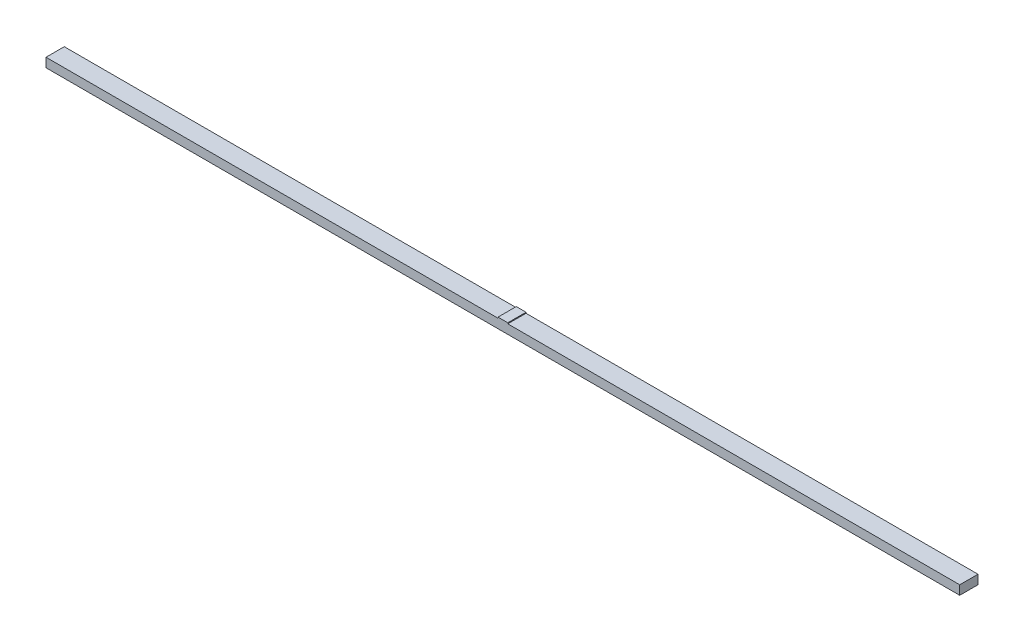
ISO-10303-21;
HEADER;
FILE_DESCRIPTION(('STEP AP214'),'2;1');
FILE_NAME('part.step','',(''),(''),'','','');
FILE_SCHEMA(('AUTOMOTIVE_DESIGN { 1 0 10303 214 1 1 1 1 }'));
ENDSEC;
DATA;
#1=APPLICATION_CONTEXT('core data for automotive mechanical design processes');
#2=APPLICATION_PROTOCOL_DEFINITION('international standard','automotive_design',2000,#1);
#3=PRODUCT_CONTEXT('',#1,'mechanical');
#4=PRODUCT('Part','Part','',(#3));
#5=PRODUCT_RELATED_PRODUCT_CATEGORY('part','',(#4));
#6=PRODUCT_DEFINITION_FORMATION('','',#4);
#7=PRODUCT_DEFINITION_CONTEXT('part definition',#1,'design');
#8=PRODUCT_DEFINITION('design','',#6,#7);
#9=PRODUCT_DEFINITION_SHAPE('','',#8);
#10=(LENGTH_UNIT() NAMED_UNIT(*) SI_UNIT(.MILLI.,.METRE.));
#11=(NAMED_UNIT(*) PLANE_ANGLE_UNIT() SI_UNIT($,.RADIAN.));
#12=(NAMED_UNIT(*) SI_UNIT($,.STERADIAN.) SOLID_ANGLE_UNIT());
#13=UNCERTAINTY_MEASURE_WITH_UNIT(LENGTH_MEASURE(1.E-05),#10,'distance_accuracy_value','');
#14=(GEOMETRIC_REPRESENTATION_CONTEXT(3) GLOBAL_UNCERTAINTY_ASSIGNED_CONTEXT((#13)) GLOBAL_UNIT_ASSIGNED_CONTEXT((#10,
#11,#12)) REPRESENTATION_CONTEXT('',''));
#15=CARTESIAN_POINT('',(0.,0.,0.));
#16=DIRECTION('',(0.,0.,1.));
#17=DIRECTION('',(1.,0.,0.));
#18=AXIS2_PLACEMENT_3D('',#15,#16,#17);
#19=CARTESIAN_POINT('',(500.,9.99999999999993,20.));
#20=DIRECTION('',(0.,-1.,0.));
#21=DIRECTION('',(0.,0.,-1.));
#22=AXIS2_PLACEMENT_3D('',#19,#20,#21);
#23=PLANE('',#22);
#24=DIRECTION('',(0.,0.,-1.));
#25=VECTOR('',#24,1.);
#26=CARTESIAN_POINT('',(5.36262654675568,9.99999999999993,20.));
#27=LINE('',#26,#25);
#28=CARTESIAN_POINT('',(5.36262654675568,9.99999999999993,20.));
#29=VERTEX_POINT('',#28);
#30=CARTESIAN_POINT('',(5.36262654675568,9.99999999999993,0.));
#31=VERTEX_POINT('',#30);
#32=EDGE_CURVE('E62',#29,#31,#27,.T.);
#33=ORIENTED_EDGE('',*,*,#32,.F.);
#34=DIRECTION('',(1.,0.,0.));
#35=VECTOR('',#34,1.);
#36=CARTESIAN_POINT('',(500.,9.99999999999993,20.));
#37=LINE('',#36,#35);
#38=CARTESIAN_POINT('',(500.,9.99999999999993,20.));
#39=VERTEX_POINT('',#38);
#40=EDGE_CURVE('E148',#39,#29,#37,.F.);
#41=ORIENTED_EDGE('',*,*,#40,.F.);
#42=DIRECTION('',(0.,0.,-1.));
#43=VECTOR('',#42,1.);
#44=CARTESIAN_POINT('',(500.,9.99999999999993,20.));
#45=LINE('',#44,#43);
#46=CARTESIAN_POINT('',(500.,9.99999999999993,0.));
#47=VERTEX_POINT('',#46);
#48=EDGE_CURVE('E163',#39,#47,#45,.T.);
#49=ORIENTED_EDGE('',*,*,#48,.T.);
#50=DIRECTION('',(1.,0.,0.));
#51=VECTOR('',#50,1.);
#52=CARTESIAN_POINT('',(500.,9.99999999999993,0.));
#53=LINE('',#52,#51);
#54=EDGE_CURVE('E142',#47,#31,#53,.F.);
#55=ORIENTED_EDGE('',*,*,#54,.T.);
#56=EDGE_LOOP('',(#33,#41,#49,#55));
#57=FACE_BOUND('',#56,.T.);
#58=ADVANCED_FACE('F47',(#57),#23,.F.);
#59=DIRECTION('',(0.,0.,1.));
#60=VECTOR('',#59,1.);
#61=CARTESIAN_POINT('',(-5.36262654675568,9.99999999999993,20.));
#62=LINE('',#61,#60);
#63=CARTESIAN_POINT('',(-5.36262654675568,9.99999999999993,0.));
#64=VERTEX_POINT('',#63);
#65=CARTESIAN_POINT('',(-5.36262654675568,9.99999999999993,20.));
#66=VERTEX_POINT('',#65);
#67=EDGE_CURVE('E70',#64,#66,#62,.T.);
#68=ORIENTED_EDGE('',*,*,#67,.F.);
#69=CARTESIAN_POINT('',(-500.,9.99999999999993,0.));
#70=VERTEX_POINT('',#69);
#71=EDGE_CURVE('E138',#64,#70,#53,.F.);
#72=ORIENTED_EDGE('',*,*,#71,.T.);
#73=DIRECTION('',(0.,0.,-1.));
#74=VECTOR('',#73,1.);
#75=CARTESIAN_POINT('',(-500.,9.99999999999993,20.));
#76=LINE('',#75,#74);
#77=CARTESIAN_POINT('',(-500.,9.99999999999993,20.));
#78=VERTEX_POINT('',#77);
#79=EDGE_CURVE('E11',#78,#70,#76,.T.);
#80=ORIENTED_EDGE('',*,*,#79,.F.);
#81=EDGE_CURVE('E152',#66,#78,#37,.F.);
#82=ORIENTED_EDGE('',*,*,#81,.F.);
#83=EDGE_LOOP('',(#68,#72,#80,#82));
#84=FACE_BOUND('',#83,.T.);
#85=ADVANCED_FACE('F201',(#84),#23,.F.);
#86=CARTESIAN_POINT('',(-500.,0.,20.));
#87=DIRECTION('',(-1.,0.,0.));
#88=DIRECTION('',(0.,0.,1.));
#89=AXIS2_PLACEMENT_3D('',#86,#87,#88);
#90=PLANE('',#89);
#91=DIRECTION('',(0.,1.,0.));
#92=VECTOR('',#91,1.);
#93=CARTESIAN_POINT('',(-500.,0.,0.));
#94=LINE('',#93,#92);
#95=CARTESIAN_POINT('',(-500.,0.,0.));
#96=VERTEX_POINT('',#95);
#97=EDGE_CURVE('E166',#96,#70,#94,.T.);
#98=ORIENTED_EDGE('',*,*,#97,.F.);
#99=DIRECTION('',(0.,0.,-1.));
#100=VECTOR('',#99,1.);
#101=CARTESIAN_POINT('',(-500.,0.,20.));
#102=LINE('',#101,#100);
#103=CARTESIAN_POINT('',(-500.,0.,20.));
#104=VERTEX_POINT('',#103);
#105=EDGE_CURVE('E55',#104,#96,#102,.T.);
#106=ORIENTED_EDGE('',*,*,#105,.F.);
#107=DIRECTION('',(0.,1.,0.));
#108=VECTOR('',#107,1.);
#109=CARTESIAN_POINT('',(-500.,0.,20.));
#110=LINE('',#109,#108);
#111=EDGE_CURVE('E151',#104,#78,#110,.T.);
#112=ORIENTED_EDGE('',*,*,#111,.T.);
#113=ORIENTED_EDGE('',*,*,#79,.T.);
#114=EDGE_LOOP('',(#98,#106,#112,#113));
#115=FACE_BOUND('',#114,.T.);
#116=ADVANCED_FACE('F190',(#115),#90,.T.);
#117=CARTESIAN_POINT('',(500.,0.,20.));
#118=DIRECTION('',(0.,-1.,0.));
#119=DIRECTION('',(0.,0.,-1.));
#120=AXIS2_PLACEMENT_3D('',#117,#118,#119);
#121=PLANE('',#120);
#122=DIRECTION('',(-1.,0.,0.));
#123=VECTOR('',#122,1.);
#124=CARTESIAN_POINT('',(500.,0.,0.));
#125=LINE('',#124,#123);
#126=CARTESIAN_POINT('',(500.,0.,0.));
#127=VERTEX_POINT('',#126);
#128=EDGE_CURVE('E170',#127,#96,#125,.T.);
#129=ORIENTED_EDGE('',*,*,#128,.F.);
#130=DIRECTION('',(0.,0.,-1.));
#131=VECTOR('',#130,1.);
#132=CARTESIAN_POINT('',(500.,0.,20.));
#133=LINE('',#132,#131);
#134=CARTESIAN_POINT('',(500.,0.,20.));
#135=VERTEX_POINT('',#134);
#136=EDGE_CURVE('E180',#135,#127,#133,.T.);
#137=ORIENTED_EDGE('',*,*,#136,.F.);
#138=DIRECTION('',(-1.,0.,0.));
#139=VECTOR('',#138,1.);
#140=CARTESIAN_POINT('',(500.,0.,20.));
#141=LINE('',#140,#139);
#142=EDGE_CURVE('E156',#135,#104,#141,.T.);
#143=ORIENTED_EDGE('',*,*,#142,.T.);
#144=ORIENTED_EDGE('',*,*,#105,.T.);
#145=EDGE_LOOP('',(#129,#137,#143,#144));
#146=FACE_BOUND('',#145,.T.);
#147=ADVANCED_FACE('F186',(#146),#121,.T.);
#148=CARTESIAN_POINT('',(500.,9.99999999999993,20.));
#149=DIRECTION('',(1.,0.,0.));
#150=DIRECTION('',(0.,0.,-1.));
#151=AXIS2_PLACEMENT_3D('',#148,#149,#150);
#152=PLANE('',#151);
#153=DIRECTION('',(0.,-1.,0.));
#154=VECTOR('',#153,1.);
#155=CARTESIAN_POINT('',(500.,9.99999999999993,0.));
#156=LINE('',#155,#154);
#157=EDGE_CURVE('E174',#47,#127,#156,.T.);
#158=ORIENTED_EDGE('',*,*,#157,.F.);
#159=ORIENTED_EDGE('',*,*,#48,.F.);
#160=DIRECTION('',(0.,-1.,0.));
#161=VECTOR('',#160,1.);
#162=CARTESIAN_POINT('',(500.,9.99999999999993,20.));
#163=LINE('',#162,#161);
#164=EDGE_CURVE('E160',#39,#135,#163,.T.);
#165=ORIENTED_EDGE('',*,*,#164,.T.);
#166=ORIENTED_EDGE('',*,*,#136,.T.);
#167=EDGE_LOOP('',(#158,#159,#165,#166));
#168=FACE_BOUND('',#167,.T.);
#169=ADVANCED_FACE('F194',(#168),#152,.T.);
#170=CARTESIAN_POINT('',(0.,0.,20.));
#171=DIRECTION('',(0.,0.,1.));
#172=DIRECTION('',(1.,0.,0.));
#173=AXIS2_PLACEMENT_3D('',#170,#171,#172);
#174=PLANE('',#173);
#175=ORIENTED_EDGE('',*,*,#40,.T.);
#176=DIRECTION('',(0.,-1.,0.));
#177=VECTOR('',#176,1.);
#178=CARTESIAN_POINT('',(5.36262654675568,10.9999999999999,20.));
#179=LINE('',#178,#177);
#180=CARTESIAN_POINT('',(5.36262654675568,10.9999999999999,20.));
#181=VERTEX_POINT('',#180);
#182=EDGE_CURVE('E207',#181,#29,#179,.T.);
#183=ORIENTED_EDGE('',*,*,#182,.F.);
#184=DIRECTION('',(1.,0.,0.));
#185=VECTOR('',#184,1.);
#186=CARTESIAN_POINT('',(5.36262654675568,10.9999999999999,20.));
#187=LINE('',#186,#185);
#188=CARTESIAN_POINT('',(-5.36262654675568,10.9999999999999,20.));
#189=VERTEX_POINT('',#188);
#190=EDGE_CURVE('E130',#189,#181,#187,.T.);
#191=ORIENTED_EDGE('',*,*,#190,.F.);
#192=DIRECTION('',(0.,-1.,0.));
#193=VECTOR('',#192,1.);
#194=CARTESIAN_POINT('',(-5.36262654675568,10.9999999999999,20.));
#195=LINE('',#194,#193);
#196=EDGE_CURVE('E144',#189,#66,#195,.T.);
#197=ORIENTED_EDGE('',*,*,#196,.T.);
#198=ORIENTED_EDGE('',*,*,#81,.T.);
#199=ORIENTED_EDGE('',*,*,#111,.F.);
#200=ORIENTED_EDGE('',*,*,#142,.F.);
#201=ORIENTED_EDGE('',*,*,#164,.F.);
#202=EDGE_LOOP('',(#175,#183,#191,#197,#198,#199,#200,#201));
#203=FACE_BOUND('',#202,.T.);
#204=ADVANCED_FACE('F197',(#203),#174,.T.);
#205=CARTESIAN_POINT('',(0.,0.,0.));
#206=DIRECTION('',(0.,0.,1.));
#207=DIRECTION('',(1.,0.,0.));
#208=AXIS2_PLACEMENT_3D('',#205,#206,#207);
#209=PLANE('',#208);
#210=ORIENTED_EDGE('',*,*,#54,.F.);
#211=ORIENTED_EDGE('',*,*,#157,.T.);
#212=ORIENTED_EDGE('',*,*,#128,.T.);
#213=ORIENTED_EDGE('',*,*,#97,.T.);
#214=ORIENTED_EDGE('',*,*,#71,.F.);
#215=DIRECTION('',(0.,-1.,0.));
#216=VECTOR('',#215,1.);
#217=CARTESIAN_POINT('',(-5.36262654675568,10.9999999999999,0.));
#218=LINE('',#217,#216);
#219=CARTESIAN_POINT('',(-5.36262654675568,10.9999999999999,0.));
#220=VERTEX_POINT('',#219);
#221=EDGE_CURVE('E120',#220,#64,#218,.T.);
#222=ORIENTED_EDGE('',*,*,#221,.F.);
#223=DIRECTION('',(-1.,0.,0.));
#224=VECTOR('',#223,1.);
#225=CARTESIAN_POINT('',(-5.36262654675568,10.9999999999999,0.));
#226=LINE('',#225,#224);
#227=CARTESIAN_POINT('',(5.36262654675568,10.9999999999999,0.));
#228=VERTEX_POINT('',#227);
#229=EDGE_CURVE('E113',#228,#220,#226,.T.);
#230=ORIENTED_EDGE('',*,*,#229,.F.);
#231=DIRECTION('',(0.,-1.,0.));
#232=VECTOR('',#231,1.);
#233=CARTESIAN_POINT('',(5.36262654675568,10.9999999999999,0.));
#234=LINE('',#233,#232);
#235=EDGE_CURVE('E118',#228,#31,#234,.T.);
#236=ORIENTED_EDGE('',*,*,#235,.T.);
#237=EDGE_LOOP('',(#210,#211,#212,#213,#214,#222,#230,#236));
#238=FACE_BOUND('',#237,.T.);
#239=ADVANCED_FACE('F116',(#238),#209,.F.);
#240=CARTESIAN_POINT('',(5.36262654675568,10.9999999999999,20.));
#241=DIRECTION('',(-1.,0.,0.));
#242=DIRECTION('',(0.,0.,1.));
#243=AXIS2_PLACEMENT_3D('',#240,#241,#242);
#244=PLANE('',#243);
#245=ORIENTED_EDGE('',*,*,#32,.T.);
#246=ORIENTED_EDGE('',*,*,#235,.F.);
#247=DIRECTION('',(0.,0.,-1.));
#248=VECTOR('',#247,1.);
#249=CARTESIAN_POINT('',(5.36262654675568,10.9999999999999,20.));
#250=LINE('',#249,#248);
#251=EDGE_CURVE('E125',#181,#228,#250,.T.);
#252=ORIENTED_EDGE('',*,*,#251,.F.);
#253=ORIENTED_EDGE('',*,*,#182,.T.);
#254=EDGE_LOOP('',(#245,#246,#252,#253));
#255=FACE_BOUND('',#254,.T.);
#256=ADVANCED_FACE('F136',(#255),#244,.F.);
#257=CARTESIAN_POINT('',(-5.36262654675568,10.9999999999999,20.));
#258=DIRECTION('',(1.,0.,0.));
#259=DIRECTION('',(0.,0.,-1.));
#260=AXIS2_PLACEMENT_3D('',#257,#258,#259);
#261=PLANE('',#260);
#262=ORIENTED_EDGE('',*,*,#67,.T.);
#263=ORIENTED_EDGE('',*,*,#196,.F.);
#264=DIRECTION('',(0.,0.,1.));
#265=VECTOR('',#264,1.);
#266=CARTESIAN_POINT('',(-5.36262654675568,10.9999999999999,20.));
#267=LINE('',#266,#265);
#268=EDGE_CURVE('E124',#220,#189,#267,.T.);
#269=ORIENTED_EDGE('',*,*,#268,.F.);
#270=ORIENTED_EDGE('',*,*,#221,.T.);
#271=EDGE_LOOP('',(#262,#263,#269,#270));
#272=FACE_BOUND('',#271,.T.);
#273=ADVANCED_FACE('F203',(#272),#261,.F.);
#274=CARTESIAN_POINT('',(0.,10.9999999999999,0.));
#275=DIRECTION('',(0.,-1.,0.));
#276=DIRECTION('',(0.,0.,-1.));
#277=AXIS2_PLACEMENT_3D('',#274,#275,#276);
#278=PLANE('',#277);
#279=ORIENTED_EDGE('',*,*,#251,.T.);
#280=ORIENTED_EDGE('',*,*,#229,.T.);
#281=ORIENTED_EDGE('',*,*,#268,.T.);
#282=ORIENTED_EDGE('',*,*,#190,.T.);
#283=EDGE_LOOP('',(#279,#280,#281,#282));
#284=FACE_BOUND('',#283,.T.);
#285=ADVANCED_FACE('F128',(#284),#278,.F.);
#286=CLOSED_SHELL('',(#58,#85,#116,#147,#169,#204,#239,#256,#273,#285));
#287=MANIFOLD_SOLID_BREP('B2',#286);
#288=ADVANCED_BREP_SHAPE_REPRESENTATION('',(#18,#287),#14);
#289=SHAPE_DEFINITION_REPRESENTATION(#9,#288);
ENDSEC;
END-ISO-10303-21;
